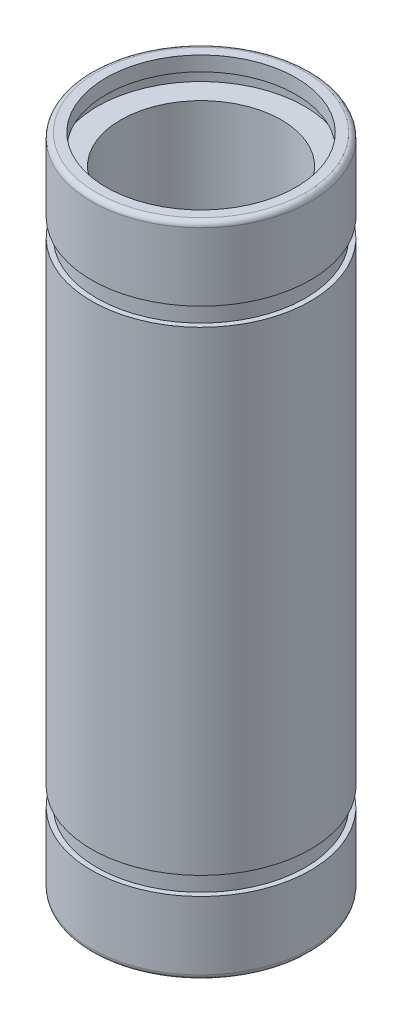
ISO-10303-21;
HEADER;
FILE_DESCRIPTION(('STEP AP214'),'2;1');
FILE_NAME('part.step','',(''),(''),'','','');
FILE_SCHEMA(('AUTOMOTIVE_DESIGN { 1 0 10303 214 1 1 1 1 }'));
ENDSEC;
DATA;
#1=APPLICATION_CONTEXT('core data for automotive mechanical design processes');
#2=APPLICATION_PROTOCOL_DEFINITION('international standard','automotive_design',2000,#1);
#3=PRODUCT_CONTEXT('',#1,'mechanical');
#4=PRODUCT('Part','Part','',(#3));
#5=PRODUCT_RELATED_PRODUCT_CATEGORY('part','',(#4));
#6=PRODUCT_DEFINITION_FORMATION('','',#4);
#7=PRODUCT_DEFINITION_CONTEXT('part definition',#1,'design');
#8=PRODUCT_DEFINITION('design','',#6,#7);
#9=PRODUCT_DEFINITION_SHAPE('','',#8);
#10=(LENGTH_UNIT() NAMED_UNIT(*) SI_UNIT(.MILLI.,.METRE.));
#11=(NAMED_UNIT(*) PLANE_ANGLE_UNIT() SI_UNIT($,.RADIAN.));
#12=(NAMED_UNIT(*) SI_UNIT($,.STERADIAN.) SOLID_ANGLE_UNIT());
#13=UNCERTAINTY_MEASURE_WITH_UNIT(LENGTH_MEASURE(1.E-05),#10,'distance_accuracy_value','');
#14=(GEOMETRIC_REPRESENTATION_CONTEXT(3) GLOBAL_UNCERTAINTY_ASSIGNED_CONTEXT((#13)) GLOBAL_UNIT_ASSIGNED_CONTEXT((#10,
#11,#12)) REPRESENTATION_CONTEXT('',''));
#15=CARTESIAN_POINT('',(0.,0.,0.));
#16=DIRECTION('',(0.,0.,1.));
#17=DIRECTION('',(1.,0.,0.));
#18=AXIS2_PLACEMENT_3D('',#15,#16,#17);
#19=CARTESIAN_POINT('',(0.,12.,0.));
#20=DIRECTION('',(0.,-1.,0.));
#21=DIRECTION('',(0.,0.,-1.));
#22=AXIS2_PLACEMENT_3D('',#19,#20,#21);
#23=CYLINDRICAL_SURFACE('',#22,7.49999999999999);
#24=CARTESIAN_POINT('',(0.,22.15,0.));
#25=DIRECTION('',(0.,-1.,0.));
#26=DIRECTION('',(0.,0.,-1.));
#27=AXIS2_PLACEMENT_3D('',#24,#25,#26);
#28=CIRCLE('',#27,7.49999999999999);
#29=CARTESIAN_POINT('',(0.,22.15,-7.5));
#30=VERTEX_POINT('',#29);
#31=EDGE_CURVE('E10',#30,#30,#28,.T.);
#32=ORIENTED_EDGE('',*,*,#31,.T.);
#33=EDGE_LOOP('',(#32));
#34=FACE_BOUND('',#33,.T.);
#35=CARTESIAN_POINT('',(0.,17.5,0.));
#36=DIRECTION('',(0.,-1.,0.));
#37=DIRECTION('',(0.,0.,-1.));
#38=AXIS2_PLACEMENT_3D('',#35,#36,#37);
#39=CIRCLE('',#38,7.49999999999999);
#40=CARTESIAN_POINT('',(0.,17.5,-7.5));
#41=VERTEX_POINT('',#40);
#42=EDGE_CURVE('E103',#41,#41,#39,.T.);
#43=ORIENTED_EDGE('',*,*,#42,.F.);
#44=EDGE_LOOP('',(#43));
#45=FACE_BOUND('',#44,.T.);
#46=ADVANCED_FACE('F33',(#34,#45),#23,.T.);
#47=CARTESIAN_POINT('',(0.,22.15,0.));
#48=DIRECTION('',(0.,-1.,0.));
#49=DIRECTION('',(0.,0.,-1.));
#50=AXIS2_PLACEMENT_3D('',#47,#48,#49);
#51=TOROIDAL_SURFACE('',#50,7.14999999999999,0.350000000000002);
#52=CARTESIAN_POINT('',(0.,22.5,0.));
#53=DIRECTION('',(0.,-1.,0.));
#54=DIRECTION('',(0.,0.,-1.));
#55=AXIS2_PLACEMENT_3D('',#52,#53,#54);
#56=CIRCLE('',#55,7.14999999999999);
#57=CARTESIAN_POINT('',(0.,22.5,-7.15));
#58=VERTEX_POINT('',#57);
#59=EDGE_CURVE('E39',#58,#58,#56,.T.);
#60=ORIENTED_EDGE('',*,*,#59,.T.);
#61=EDGE_LOOP('',(#60));
#62=FACE_BOUND('',#61,.T.);
#63=ORIENTED_EDGE('',*,*,#31,.F.);
#64=EDGE_LOOP('',(#63));
#65=FACE_BOUND('',#64,.T.);
#66=ADVANCED_FACE('F111',(#62,#65),#51,.T.);
#67=CARTESIAN_POINT('',(0.,22.5,0.));
#68=DIRECTION('',(0.,1.,0.));
#69=DIRECTION('',(0.,0.,1.));
#70=AXIS2_PLACEMENT_3D('',#67,#68,#69);
#71=PLANE('',#70);
#72=CARTESIAN_POINT('',(0.,22.5,0.));
#73=DIRECTION('',(0.,-1.,0.));
#74=DIRECTION('',(0.,0.,-1.));
#75=AXIS2_PLACEMENT_3D('',#72,#73,#74);
#76=CIRCLE('',#75,6.49999999999999);
#77=CARTESIAN_POINT('',(0.,22.5,-6.5));
#78=VERTEX_POINT('',#77);
#79=EDGE_CURVE('E43',#78,#78,#76,.T.);
#80=ORIENTED_EDGE('',*,*,#79,.T.);
#81=EDGE_LOOP('',(#80));
#82=FACE_BOUND('',#81,.T.);
#83=ORIENTED_EDGE('',*,*,#59,.F.);
#84=EDGE_LOOP('',(#83));
#85=FACE_BOUND('',#84,.T.);
#86=ADVANCED_FACE('F115',(#82,#85),#71,.T.);
#87=CARTESIAN_POINT('',(0.,12.,0.));
#88=DIRECTION('',(0.,-1.,0.));
#89=DIRECTION('',(0.,0.,-1.));
#90=AXIS2_PLACEMENT_3D('',#87,#88,#89);
#91=CYLINDRICAL_SURFACE('',#90,6.49999999999999);
#92=CARTESIAN_POINT('',(0.,21.5,0.));
#93=DIRECTION('',(0.,-1.,0.));
#94=DIRECTION('',(0.,0.,-1.));
#95=AXIS2_PLACEMENT_3D('',#92,#93,#94);
#96=CIRCLE('',#95,6.49999999999999);
#97=CARTESIAN_POINT('',(0.,21.5,-6.5));
#98=VERTEX_POINT('',#97);
#99=EDGE_CURVE('E47',#98,#98,#96,.T.);
#100=ORIENTED_EDGE('',*,*,#99,.T.);
#101=EDGE_LOOP('',(#100));
#102=FACE_BOUND('',#101,.T.);
#103=ORIENTED_EDGE('',*,*,#79,.F.);
#104=EDGE_LOOP('',(#103));
#105=FACE_BOUND('',#104,.T.);
#106=ADVANCED_FACE('F119',(#102,#105),#91,.F.);
#107=CARTESIAN_POINT('',(0.,21.5,0.));
#108=DIRECTION('',(0.,-1.,0.));
#109=DIRECTION('',(0.,0.,-1.));
#110=AXIS2_PLACEMENT_3D('',#107,#108,#109);
#111=PLANE('',#110);
#112=CARTESIAN_POINT('',(0.,21.5,0.));
#113=DIRECTION('',(0.,-1.,0.));
#114=DIRECTION('',(0.,0.,-1.));
#115=AXIS2_PLACEMENT_3D('',#112,#113,#114);
#116=CIRCLE('',#115,7.1);
#117=CARTESIAN_POINT('',(0.,21.5,-7.1));
#118=VERTEX_POINT('',#117);
#119=EDGE_CURVE('E52',#118,#118,#116,.T.);
#120=ORIENTED_EDGE('',*,*,#119,.T.);
#121=EDGE_LOOP('',(#120));
#122=FACE_BOUND('',#121,.T.);
#123=ORIENTED_EDGE('',*,*,#99,.F.);
#124=EDGE_LOOP('',(#123));
#125=FACE_BOUND('',#124,.T.);
#126=ADVANCED_FACE('F126',(#122,#125),#111,.T.);
#127=CARTESIAN_POINT('',(0.,12.,0.));
#128=DIRECTION('',(0.,-1.,0.));
#129=DIRECTION('',(0.,0.,-1.));
#130=AXIS2_PLACEMENT_3D('',#127,#128,#129);
#131=CYLINDRICAL_SURFACE('',#130,7.1);
#132=CARTESIAN_POINT('',(0.,20.5,0.));
#133=DIRECTION('',(0.,-1.,0.));
#134=DIRECTION('',(0.,0.,-1.));
#135=AXIS2_PLACEMENT_3D('',#132,#133,#134);
#136=CIRCLE('',#135,7.1);
#137=CARTESIAN_POINT('',(0.,20.5,-7.1));
#138=VERTEX_POINT('',#137);
#139=EDGE_CURVE('E55',#138,#138,#136,.T.);
#140=ORIENTED_EDGE('',*,*,#139,.T.);
#141=EDGE_LOOP('',(#140));
#142=FACE_BOUND('',#141,.T.);
#143=ORIENTED_EDGE('',*,*,#119,.F.);
#144=EDGE_LOOP('',(#143));
#145=FACE_BOUND('',#144,.T.);
#146=ADVANCED_FACE('F130',(#142,#145),#131,.F.);
#147=CARTESIAN_POINT('',(0.,20.5,0.));
#148=DIRECTION('',(0.,1.,0.));
#149=DIRECTION('',(0.,0.,1.));
#150=AXIS2_PLACEMENT_3D('',#147,#148,#149);
#151=PLANE('',#150);
#152=CARTESIAN_POINT('',(0.,20.5,0.));
#153=DIRECTION('',(0.,-1.,0.));
#154=DIRECTION('',(0.,0.,-1.));
#155=AXIS2_PLACEMENT_3D('',#152,#153,#154);
#156=CIRCLE('',#155,5.50000000000001);
#157=CARTESIAN_POINT('',(0.,20.5,-5.50000000000001));
#158=VERTEX_POINT('',#157);
#159=EDGE_CURVE('E58',#158,#158,#156,.T.);
#160=ORIENTED_EDGE('',*,*,#159,.T.);
#161=EDGE_LOOP('',(#160));
#162=FACE_BOUND('',#161,.T.);
#163=ORIENTED_EDGE('',*,*,#139,.F.);
#164=EDGE_LOOP('',(#163));
#165=FACE_BOUND('',#164,.T.);
#166=ADVANCED_FACE('F134',(#162,#165),#151,.T.);
#167=CARTESIAN_POINT('',(0.,12.,0.));
#168=DIRECTION('',(0.,-1.,0.));
#169=DIRECTION('',(0.,0.,-1.));
#170=AXIS2_PLACEMENT_3D('',#167,#168,#169);
#171=CYLINDRICAL_SURFACE('',#170,5.50000000000001);
#172=CARTESIAN_POINT('',(0.,-20.5,0.));
#173=DIRECTION('',(0.,-1.,0.));
#174=DIRECTION('',(0.,0.,-1.));
#175=AXIS2_PLACEMENT_3D('',#172,#173,#174);
#176=CIRCLE('',#175,5.50000000000002);
#177=CARTESIAN_POINT('',(0.,-20.5,-5.50000000000002));
#178=VERTEX_POINT('',#177);
#179=EDGE_CURVE('E61',#178,#178,#176,.T.);
#180=ORIENTED_EDGE('',*,*,#179,.T.);
#181=EDGE_LOOP('',(#180));
#182=FACE_BOUND('',#181,.T.);
#183=ORIENTED_EDGE('',*,*,#159,.F.);
#184=EDGE_LOOP('',(#183));
#185=FACE_BOUND('',#184,.T.);
#186=ADVANCED_FACE('F138',(#182,#185),#171,.F.);
#187=CARTESIAN_POINT('',(0.,-20.5,0.));
#188=DIRECTION('',(0.,1.,0.));
#189=DIRECTION('',(0.,0.,1.));
#190=AXIS2_PLACEMENT_3D('',#187,#188,#189);
#191=PLANE('',#190);
#192=ORIENTED_EDGE('',*,*,#179,.F.);
#193=EDGE_LOOP('',(#192));
#194=FACE_BOUND('',#193,.T.);
#195=CARTESIAN_POINT('',(0.,-20.5,0.));
#196=DIRECTION('',(0.,-1.,0.));
#197=DIRECTION('',(0.,0.,-1.));
#198=AXIS2_PLACEMENT_3D('',#195,#196,#197);
#199=CIRCLE('',#198,7.10000000000001);
#200=CARTESIAN_POINT('',(0.,-20.5,-7.10000000000001));
#201=VERTEX_POINT('',#200);
#202=EDGE_CURVE('E64',#201,#201,#199,.T.);
#203=ORIENTED_EDGE('',*,*,#202,.T.);
#204=EDGE_LOOP('',(#203));
#205=FACE_BOUND('',#204,.T.);
#206=ADVANCED_FACE('F142',(#194,#205),#191,.F.);
#207=CARTESIAN_POINT('',(0.,12.,0.));
#208=DIRECTION('',(0.,-1.,0.));
#209=DIRECTION('',(0.,0.,-1.));
#210=AXIS2_PLACEMENT_3D('',#207,#208,#209);
#211=CYLINDRICAL_SURFACE('',#210,7.10000000000001);
#212=ORIENTED_EDGE('',*,*,#202,.F.);
#213=EDGE_LOOP('',(#212));
#214=FACE_BOUND('',#213,.T.);
#215=CARTESIAN_POINT('',(0.,-21.5,0.));
#216=DIRECTION('',(0.,-1.,0.));
#217=DIRECTION('',(0.,0.,-1.));
#218=AXIS2_PLACEMENT_3D('',#215,#216,#217);
#219=CIRCLE('',#218,7.10000000000001);
#220=CARTESIAN_POINT('',(0.,-21.5,-7.10000000000001));
#221=VERTEX_POINT('',#220);
#222=EDGE_CURVE('E67',#221,#221,#219,.T.);
#223=ORIENTED_EDGE('',*,*,#222,.T.);
#224=EDGE_LOOP('',(#223));
#225=FACE_BOUND('',#224,.T.);
#226=ADVANCED_FACE('F146',(#214,#225),#211,.F.);
#227=CARTESIAN_POINT('',(0.,-21.5,0.));
#228=DIRECTION('',(0.,-1.,0.));
#229=DIRECTION('',(0.,0.,-1.));
#230=AXIS2_PLACEMENT_3D('',#227,#228,#229);
#231=PLANE('',#230);
#232=ORIENTED_EDGE('',*,*,#222,.F.);
#233=EDGE_LOOP('',(#232));
#234=FACE_BOUND('',#233,.T.);
#235=CARTESIAN_POINT('',(0.,-21.5,0.));
#236=DIRECTION('',(0.,-1.,0.));
#237=DIRECTION('',(0.,0.,-1.));
#238=AXIS2_PLACEMENT_3D('',#235,#236,#237);
#239=CIRCLE('',#238,6.5);
#240=CARTESIAN_POINT('',(0.,-21.5,-6.5));
#241=VERTEX_POINT('',#240);
#242=EDGE_CURVE('E70',#241,#241,#239,.T.);
#243=ORIENTED_EDGE('',*,*,#242,.T.);
#244=EDGE_LOOP('',(#243));
#245=FACE_BOUND('',#244,.T.);
#246=ADVANCED_FACE('F150',(#234,#245),#231,.F.);
#247=CARTESIAN_POINT('',(0.,12.,0.));
#248=DIRECTION('',(0.,-1.,0.));
#249=DIRECTION('',(0.,0.,-1.));
#250=AXIS2_PLACEMENT_3D('',#247,#248,#249);
#251=CYLINDRICAL_SURFACE('',#250,6.5);
#252=ORIENTED_EDGE('',*,*,#242,.F.);
#253=EDGE_LOOP('',(#252));
#254=FACE_BOUND('',#253,.T.);
#255=CARTESIAN_POINT('',(0.,-22.5,0.));
#256=DIRECTION('',(0.,-1.,0.));
#257=DIRECTION('',(0.,0.,-1.));
#258=AXIS2_PLACEMENT_3D('',#255,#256,#257);
#259=CIRCLE('',#258,6.5);
#260=CARTESIAN_POINT('',(0.,-22.5,-6.5));
#261=VERTEX_POINT('',#260);
#262=EDGE_CURVE('E73',#261,#261,#259,.T.);
#263=ORIENTED_EDGE('',*,*,#262,.T.);
#264=EDGE_LOOP('',(#263));
#265=FACE_BOUND('',#264,.T.);
#266=ADVANCED_FACE('F154',(#254,#265),#251,.F.);
#267=CARTESIAN_POINT('',(0.,-22.5,0.));
#268=DIRECTION('',(0.,1.,0.));
#269=DIRECTION('',(0.,0.,1.));
#270=AXIS2_PLACEMENT_3D('',#267,#268,#269);
#271=PLANE('',#270);
#272=ORIENTED_EDGE('',*,*,#262,.F.);
#273=EDGE_LOOP('',(#272));
#274=FACE_BOUND('',#273,.T.);
#275=CARTESIAN_POINT('',(0.,-22.5,0.));
#276=DIRECTION('',(0.,-1.,0.));
#277=DIRECTION('',(0.,0.,-1.));
#278=AXIS2_PLACEMENT_3D('',#275,#276,#277);
#279=CIRCLE('',#278,7.15);
#280=CARTESIAN_POINT('',(0.,-22.5,-7.15));
#281=VERTEX_POINT('',#280);
#282=EDGE_CURVE('E76',#281,#281,#279,.T.);
#283=ORIENTED_EDGE('',*,*,#282,.T.);
#284=EDGE_LOOP('',(#283));
#285=FACE_BOUND('',#284,.T.);
#286=ADVANCED_FACE('F158',(#274,#285),#271,.F.);
#287=CARTESIAN_POINT('',(0.,-22.15,0.));
#288=DIRECTION('',(0.,-1.,0.));
#289=DIRECTION('',(0.,0.,-1.));
#290=AXIS2_PLACEMENT_3D('',#287,#288,#289);
#291=TOROIDAL_SURFACE('',#290,7.15,0.350000000000002);
#292=ORIENTED_EDGE('',*,*,#282,.F.);
#293=EDGE_LOOP('',(#292));
#294=FACE_BOUND('',#293,.T.);
#295=CARTESIAN_POINT('',(0.,-22.15,0.));
#296=DIRECTION('',(0.,-1.,0.));
#297=DIRECTION('',(0.,0.,-1.));
#298=AXIS2_PLACEMENT_3D('',#295,#296,#297);
#299=CIRCLE('',#298,7.5);
#300=CARTESIAN_POINT('',(0.,-22.15,-7.5));
#301=VERTEX_POINT('',#300);
#302=EDGE_CURVE('E79',#301,#301,#299,.T.);
#303=ORIENTED_EDGE('',*,*,#302,.T.);
#304=EDGE_LOOP('',(#303));
#305=FACE_BOUND('',#304,.T.);
#306=ADVANCED_FACE('F162',(#294,#305),#291,.T.);
#307=CARTESIAN_POINT('',(0.,12.,0.));
#308=DIRECTION('',(0.,-1.,0.));
#309=DIRECTION('',(0.,0.,-1.));
#310=AXIS2_PLACEMENT_3D('',#307,#308,#309);
#311=CYLINDRICAL_SURFACE('',#310,7.5);
#312=CARTESIAN_POINT('',(0.,-17.5,0.));
#313=DIRECTION('',(0.,-1.,0.));
#314=DIRECTION('',(0.,0.,-1.));
#315=AXIS2_PLACEMENT_3D('',#312,#313,#314);
#316=CIRCLE('',#315,7.5);
#317=CARTESIAN_POINT('',(0.,-17.5,-7.5));
#318=VERTEX_POINT('',#317);
#319=EDGE_CURVE('E82',#318,#318,#316,.T.);
#320=ORIENTED_EDGE('',*,*,#319,.T.);
#321=EDGE_LOOP('',(#320));
#322=FACE_BOUND('',#321,.T.);
#323=ORIENTED_EDGE('',*,*,#302,.F.);
#324=EDGE_LOOP('',(#323));
#325=FACE_BOUND('',#324,.T.);
#326=ADVANCED_FACE('F166',(#322,#325),#311,.T.);
#327=CARTESIAN_POINT('',(0.,-17.5,0.));
#328=DIRECTION('',(0.,-1.,0.));
#329=DIRECTION('',(0.,0.,-1.));
#330=AXIS2_PLACEMENT_3D('',#327,#328,#329);
#331=PLANE('',#330);
#332=ORIENTED_EDGE('',*,*,#319,.F.);
#333=EDGE_LOOP('',(#332));
#334=FACE_BOUND('',#333,.T.);
#335=CARTESIAN_POINT('',(0.,-17.5,0.));
#336=DIRECTION('',(0.,-1.,0.));
#337=DIRECTION('',(0.,0.,-1.));
#338=AXIS2_PLACEMENT_3D('',#335,#336,#337);
#339=CIRCLE('',#338,7.15);
#340=CARTESIAN_POINT('',(0.,-17.5,-7.15));
#341=VERTEX_POINT('',#340);
#342=EDGE_CURVE('E85',#341,#341,#339,.T.);
#343=ORIENTED_EDGE('',*,*,#342,.T.);
#344=EDGE_LOOP('',(#343));
#345=FACE_BOUND('',#344,.T.);
#346=ADVANCED_FACE('F170',(#334,#345),#331,.F.);
#347=CARTESIAN_POINT('',(0.,12.,0.));
#348=DIRECTION('',(0.,-1.,0.));
#349=DIRECTION('',(0.,0.,-1.));
#350=AXIS2_PLACEMENT_3D('',#347,#348,#349);
#351=CYLINDRICAL_SURFACE('',#350,7.15);
#352=ORIENTED_EDGE('',*,*,#342,.F.);
#353=EDGE_LOOP('',(#352));
#354=FACE_BOUND('',#353,.T.);
#355=CARTESIAN_POINT('',(0.,-16.25,0.));
#356=DIRECTION('',(0.,-1.,0.));
#357=DIRECTION('',(0.,0.,-1.));
#358=AXIS2_PLACEMENT_3D('',#355,#356,#357);
#359=CIRCLE('',#358,7.15);
#360=CARTESIAN_POINT('',(0.,-16.25,-7.15));
#361=VERTEX_POINT('',#360);
#362=EDGE_CURVE('E88',#361,#361,#359,.T.);
#363=ORIENTED_EDGE('',*,*,#362,.T.);
#364=EDGE_LOOP('',(#363));
#365=FACE_BOUND('',#364,.T.);
#366=ADVANCED_FACE('F174',(#354,#365),#351,.T.);
#367=CARTESIAN_POINT('',(0.,-16.25,0.));
#368=DIRECTION('',(0.,1.,0.));
#369=DIRECTION('',(0.,0.,1.));
#370=AXIS2_PLACEMENT_3D('',#367,#368,#369);
#371=PLANE('',#370);
#372=ORIENTED_EDGE('',*,*,#362,.F.);
#373=EDGE_LOOP('',(#372));
#374=FACE_BOUND('',#373,.T.);
#375=CARTESIAN_POINT('',(0.,-16.25,0.));
#376=DIRECTION('',(0.,-1.,0.));
#377=DIRECTION('',(0.,0.,-1.));
#378=AXIS2_PLACEMENT_3D('',#375,#376,#377);
#379=CIRCLE('',#378,7.5);
#380=CARTESIAN_POINT('',(0.,-16.25,-7.5));
#381=VERTEX_POINT('',#380);
#382=EDGE_CURVE('E91',#381,#381,#379,.T.);
#383=ORIENTED_EDGE('',*,*,#382,.T.);
#384=EDGE_LOOP('',(#383));
#385=FACE_BOUND('',#384,.T.);
#386=ADVANCED_FACE('F178',(#374,#385),#371,.F.);
#387=CARTESIAN_POINT('',(0.,12.,0.));
#388=DIRECTION('',(0.,-1.,0.));
#389=DIRECTION('',(0.,0.,-1.));
#390=AXIS2_PLACEMENT_3D('',#387,#388,#389);
#391=CYLINDRICAL_SURFACE('',#390,7.5);
#392=CARTESIAN_POINT('',(0.,16.25,0.));
#393=DIRECTION('',(0.,-1.,0.));
#394=DIRECTION('',(0.,0.,-1.));
#395=AXIS2_PLACEMENT_3D('',#392,#393,#394);
#396=CIRCLE('',#395,7.49999999999999);
#397=CARTESIAN_POINT('',(0.,16.25,-7.5));
#398=VERTEX_POINT('',#397);
#399=EDGE_CURVE('E94',#398,#398,#396,.T.);
#400=ORIENTED_EDGE('',*,*,#399,.T.);
#401=EDGE_LOOP('',(#400));
#402=FACE_BOUND('',#401,.T.);
#403=ORIENTED_EDGE('',*,*,#382,.F.);
#404=EDGE_LOOP('',(#403));
#405=FACE_BOUND('',#404,.T.);
#406=ADVANCED_FACE('F182',(#402,#405),#391,.T.);
#407=CARTESIAN_POINT('',(0.,16.25,0.));
#408=DIRECTION('',(0.,1.,0.));
#409=DIRECTION('',(0.,0.,1.));
#410=AXIS2_PLACEMENT_3D('',#407,#408,#409);
#411=PLANE('',#410);
#412=CARTESIAN_POINT('',(0.,16.25,0.));
#413=DIRECTION('',(0.,-1.,0.));
#414=DIRECTION('',(0.,0.,-1.));
#415=AXIS2_PLACEMENT_3D('',#412,#413,#414);
#416=CIRCLE('',#415,7.15);
#417=CARTESIAN_POINT('',(0.,16.25,-7.15));
#418=VERTEX_POINT('',#417);
#419=EDGE_CURVE('E97',#418,#418,#416,.T.);
#420=ORIENTED_EDGE('',*,*,#419,.T.);
#421=EDGE_LOOP('',(#420));
#422=FACE_BOUND('',#421,.T.);
#423=ORIENTED_EDGE('',*,*,#399,.F.);
#424=EDGE_LOOP('',(#423));
#425=FACE_BOUND('',#424,.T.);
#426=ADVANCED_FACE('F186',(#422,#425),#411,.T.);
#427=CARTESIAN_POINT('',(0.,12.,0.));
#428=DIRECTION('',(0.,-1.,0.));
#429=DIRECTION('',(0.,0.,-1.));
#430=AXIS2_PLACEMENT_3D('',#427,#428,#429);
#431=CYLINDRICAL_SURFACE('',#430,7.15);
#432=CARTESIAN_POINT('',(0.,17.5,0.));
#433=DIRECTION('',(0.,-1.,0.));
#434=DIRECTION('',(0.,0.,-1.));
#435=AXIS2_PLACEMENT_3D('',#432,#433,#434);
#436=CIRCLE('',#435,7.15);
#437=CARTESIAN_POINT('',(0.,17.5,-7.15));
#438=VERTEX_POINT('',#437);
#439=EDGE_CURVE('E100',#438,#438,#436,.T.);
#440=ORIENTED_EDGE('',*,*,#439,.T.);
#441=EDGE_LOOP('',(#440));
#442=FACE_BOUND('',#441,.T.);
#443=ORIENTED_EDGE('',*,*,#419,.F.);
#444=EDGE_LOOP('',(#443));
#445=FACE_BOUND('',#444,.T.);
#446=ADVANCED_FACE('F190',(#442,#445),#431,.T.);
#447=CARTESIAN_POINT('',(0.,17.5,0.));
#448=DIRECTION('',(0.,-1.,0.));
#449=DIRECTION('',(0.,0.,-1.));
#450=AXIS2_PLACEMENT_3D('',#447,#448,#449);
#451=PLANE('',#450);
#452=ORIENTED_EDGE('',*,*,#42,.T.);
#453=EDGE_LOOP('',(#452));
#454=FACE_BOUND('',#453,.T.);
#455=ORIENTED_EDGE('',*,*,#439,.F.);
#456=EDGE_LOOP('',(#455));
#457=FACE_BOUND('',#456,.T.);
#458=ADVANCED_FACE('F107',(#454,#457),#451,.T.);
#459=CLOSED_SHELL('',(#46,#66,#86,#106,#126,#146,#166,#186,#206,#226,#246,#266,#286,#306,#326,
#346,#366,#386,#406,#426,#446,#458));
#460=MANIFOLD_SOLID_BREP('B2',#459);
#461=ADVANCED_BREP_SHAPE_REPRESENTATION('',(#18,#460),#14);
#462=SHAPE_DEFINITION_REPRESENTATION(#9,#461);
ENDSEC;
END-ISO-10303-21;
